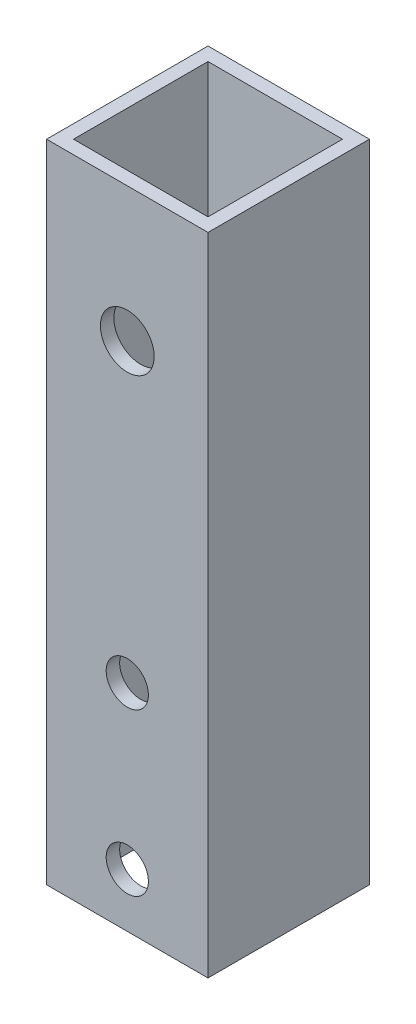
ISO-10303-21;
HEADER;
FILE_DESCRIPTION(('STEP AP214'),'2;1');
FILE_NAME('part.step','',(''),(''),'','','');
FILE_SCHEMA(('AUTOMOTIVE_DESIGN { 1 0 10303 214 1 1 1 1 }'));
ENDSEC;
DATA;
#1=APPLICATION_CONTEXT('core data for automotive mechanical design processes');
#2=APPLICATION_PROTOCOL_DEFINITION('international standard','automotive_design',2000,#1);
#3=PRODUCT_CONTEXT('',#1,'mechanical');
#4=PRODUCT('Part','Part','',(#3));
#5=PRODUCT_RELATED_PRODUCT_CATEGORY('part','',(#4));
#6=PRODUCT_DEFINITION_FORMATION('','',#4);
#7=PRODUCT_DEFINITION_CONTEXT('part definition',#1,'design');
#8=PRODUCT_DEFINITION('design','',#6,#7);
#9=PRODUCT_DEFINITION_SHAPE('','',#8);
#10=(LENGTH_UNIT() NAMED_UNIT(*) SI_UNIT(.MILLI.,.METRE.));
#11=(NAMED_UNIT(*) PLANE_ANGLE_UNIT() SI_UNIT($,.RADIAN.));
#12=(NAMED_UNIT(*) SI_UNIT($,.STERADIAN.) SOLID_ANGLE_UNIT());
#13=UNCERTAINTY_MEASURE_WITH_UNIT(LENGTH_MEASURE(1.E-05),#10,'distance_accuracy_value','');
#14=(GEOMETRIC_REPRESENTATION_CONTEXT(3) GLOBAL_UNCERTAINTY_ASSIGNED_CONTEXT((#13)) GLOBAL_UNIT_ASSIGNED_CONTEXT((#10,
#11,#12)) REPRESENTATION_CONTEXT('',''));
#15=CARTESIAN_POINT('',(0.,0.,0.));
#16=DIRECTION('',(0.,0.,1.));
#17=DIRECTION('',(1.,0.,0.));
#18=AXIS2_PLACEMENT_3D('',#15,#16,#17);
#19=CARTESIAN_POINT('',(0.,76.2,0.));
#20=DIRECTION('',(0.,-1.,0.));
#21=DIRECTION('',(0.,0.,-1.));
#22=AXIS2_PLACEMENT_3D('',#19,#20,#21);
#23=PLANE('',#22);
#24=DIRECTION('',(0.,0.,-1.));
#25=VECTOR('',#24,1.);
#26=CARTESIAN_POINT('',(9.525,76.2,9.525));
#27=LINE('',#26,#25);
#28=CARTESIAN_POINT('',(9.525,76.2,9.525));
#29=VERTEX_POINT('',#28);
#30=CARTESIAN_POINT('',(9.525,76.2,-9.525));
#31=VERTEX_POINT('',#30);
#32=EDGE_CURVE('E141',#29,#31,#27,.T.);
#33=ORIENTED_EDGE('',*,*,#32,.T.);
#34=DIRECTION('',(-1.,0.,0.));
#35=VECTOR('',#34,1.);
#36=CARTESIAN_POINT('',(-9.525,76.2,-9.525));
#37=LINE('',#36,#35);
#38=CARTESIAN_POINT('',(-9.525,76.2,-9.525));
#39=VERTEX_POINT('',#38);
#40=EDGE_CURVE('E144',#31,#39,#37,.T.);
#41=ORIENTED_EDGE('',*,*,#40,.T.);
#42=DIRECTION('',(0.,0.,1.));
#43=VECTOR('',#42,1.);
#44=CARTESIAN_POINT('',(-9.525,76.2,9.525));
#45=LINE('',#44,#43);
#46=CARTESIAN_POINT('',(-9.525,76.2,9.525));
#47=VERTEX_POINT('',#46);
#48=EDGE_CURVE('E147',#39,#47,#45,.T.);
#49=ORIENTED_EDGE('',*,*,#48,.T.);
#50=DIRECTION('',(1.,0.,0.));
#51=VECTOR('',#50,1.);
#52=CARTESIAN_POINT('',(-9.525,76.2,9.525));
#53=LINE('',#52,#51);
#54=EDGE_CURVE('E149',#47,#29,#53,.T.);
#55=ORIENTED_EDGE('',*,*,#54,.T.);
#56=EDGE_LOOP('',(#33,#41,#49,#55));
#57=FACE_BOUND('',#56,.T.);
#58=DIRECTION('',(0.,0.,1.));
#59=VECTOR('',#58,1.);
#60=CARTESIAN_POINT('',(-7.9375,76.2,7.9375));
#61=LINE('',#60,#59);
#62=CARTESIAN_POINT('',(-7.9375,76.2,-7.9375));
#63=VERTEX_POINT('',#62);
#64=CARTESIAN_POINT('',(-7.9375,76.2,7.9375));
#65=VERTEX_POINT('',#64);
#66=EDGE_CURVE('E103',#63,#65,#61,.T.);
#67=ORIENTED_EDGE('',*,*,#66,.F.);
#68=DIRECTION('',(-1.,0.,0.));
#69=VECTOR('',#68,1.);
#70=CARTESIAN_POINT('',(-7.9375,76.2,-7.9375));
#71=LINE('',#70,#69);
#72=CARTESIAN_POINT('',(7.9375,76.2,-7.9375));
#73=VERTEX_POINT('',#72);
#74=EDGE_CURVE('E125',#73,#63,#71,.T.);
#75=ORIENTED_EDGE('',*,*,#74,.F.);
#76=DIRECTION('',(0.,0.,-1.));
#77=VECTOR('',#76,1.);
#78=CARTESIAN_POINT('',(7.9375,76.2,7.9375));
#79=LINE('',#78,#77);
#80=CARTESIAN_POINT('',(7.9375,76.2,7.9375));
#81=VERTEX_POINT('',#80);
#82=EDGE_CURVE('E123',#81,#73,#79,.T.);
#83=ORIENTED_EDGE('',*,*,#82,.F.);
#84=DIRECTION('',(1.,0.,0.));
#85=VECTOR('',#84,1.);
#86=CARTESIAN_POINT('',(-7.9375,76.2,7.9375));
#87=LINE('',#86,#85);
#88=EDGE_CURVE('E111',#65,#81,#87,.T.);
#89=ORIENTED_EDGE('',*,*,#88,.F.);
#90=EDGE_LOOP('',(#67,#75,#83,#89));
#91=FACE_BOUND('',#90,.T.);
#92=ADVANCED_FACE('F36',(#57,#91),#23,.F.);
#93=CARTESIAN_POINT('',(0.,0.,0.));
#94=DIRECTION('',(0.,-1.,0.));
#95=DIRECTION('',(0.,0.,-1.));
#96=AXIS2_PLACEMENT_3D('',#93,#94,#95);
#97=PLANE('',#96);
#98=DIRECTION('',(0.,0.,-1.));
#99=VECTOR('',#98,1.);
#100=CARTESIAN_POINT('',(9.525,0.,9.525));
#101=LINE('',#100,#99);
#102=CARTESIAN_POINT('',(9.525,0.,9.525));
#103=VERTEX_POINT('',#102);
#104=CARTESIAN_POINT('',(9.525,0.,-9.525));
#105=VERTEX_POINT('',#104);
#106=EDGE_CURVE('E119',#103,#105,#101,.T.);
#107=ORIENTED_EDGE('',*,*,#106,.F.);
#108=DIRECTION('',(1.,0.,0.));
#109=VECTOR('',#108,1.);
#110=CARTESIAN_POINT('',(-9.525,0.,9.525));
#111=LINE('',#110,#109);
#112=CARTESIAN_POINT('',(-9.525,0.,9.525));
#113=VERTEX_POINT('',#112);
#114=EDGE_CURVE('E145',#113,#103,#111,.T.);
#115=ORIENTED_EDGE('',*,*,#114,.F.);
#116=DIRECTION('',(0.,0.,1.));
#117=VECTOR('',#116,1.);
#118=CARTESIAN_POINT('',(-9.525,0.,9.525));
#119=LINE('',#118,#117);
#120=CARTESIAN_POINT('',(-9.525,0.,-9.525));
#121=VERTEX_POINT('',#120);
#122=EDGE_CURVE('E156',#121,#113,#119,.T.);
#123=ORIENTED_EDGE('',*,*,#122,.F.);
#124=DIRECTION('',(-1.,0.,0.));
#125=VECTOR('',#124,1.);
#126=CARTESIAN_POINT('',(-9.525,0.,-9.525));
#127=LINE('',#126,#125);
#128=EDGE_CURVE('E154',#105,#121,#127,.T.);
#129=ORIENTED_EDGE('',*,*,#128,.F.);
#130=EDGE_LOOP('',(#107,#115,#123,#129));
#131=FACE_BOUND('',#130,.T.);
#132=DIRECTION('',(-1.,0.,0.));
#133=VECTOR('',#132,1.);
#134=CARTESIAN_POINT('',(-7.9375,0.,-7.9375));
#135=LINE('',#134,#133);
#136=CARTESIAN_POINT('',(7.9375,0.,-7.9375));
#137=VERTEX_POINT('',#136);
#138=CARTESIAN_POINT('',(-7.9375,0.,-7.9375));
#139=VERTEX_POINT('',#138);
#140=EDGE_CURVE('E112',#137,#139,#135,.T.);
#141=ORIENTED_EDGE('',*,*,#140,.T.);
#142=DIRECTION('',(0.,0.,1.));
#143=VECTOR('',#142,1.);
#144=CARTESIAN_POINT('',(-7.9375,0.,7.9375));
#145=LINE('',#144,#143);
#146=CARTESIAN_POINT('',(-7.9375,0.,7.9375));
#147=VERTEX_POINT('',#146);
#148=EDGE_CURVE('E61',#139,#147,#145,.T.);
#149=ORIENTED_EDGE('',*,*,#148,.T.);
#150=DIRECTION('',(1.,0.,0.));
#151=VECTOR('',#150,1.);
#152=CARTESIAN_POINT('',(-7.9375,0.,7.9375));
#153=LINE('',#152,#151);
#154=CARTESIAN_POINT('',(7.9375,0.,7.9375));
#155=VERTEX_POINT('',#154);
#156=EDGE_CURVE('E118',#147,#155,#153,.T.);
#157=ORIENTED_EDGE('',*,*,#156,.T.);
#158=DIRECTION('',(0.,0.,-1.));
#159=VECTOR('',#158,1.);
#160=CARTESIAN_POINT('',(7.9375,0.,7.9375));
#161=LINE('',#160,#159);
#162=EDGE_CURVE('E133',#155,#137,#161,.T.);
#163=ORIENTED_EDGE('',*,*,#162,.T.);
#164=EDGE_LOOP('',(#141,#149,#157,#163));
#165=FACE_BOUND('',#164,.T.);
#166=ADVANCED_FACE('F214',(#131,#165),#97,.T.);
#167=CARTESIAN_POINT('',(9.525,76.2,9.525));
#168=DIRECTION('',(-1.,0.,0.));
#169=DIRECTION('',(0.,0.,1.));
#170=AXIS2_PLACEMENT_3D('',#167,#168,#169);
#171=PLANE('',#170);
#172=ORIENTED_EDGE('',*,*,#106,.T.);
#173=DIRECTION('',(0.,-1.,0.));
#174=VECTOR('',#173,1.);
#175=CARTESIAN_POINT('',(9.525,76.2,-9.525));
#176=LINE('',#175,#174);
#177=EDGE_CURVE('E11',#31,#105,#176,.T.);
#178=ORIENTED_EDGE('',*,*,#177,.F.);
#179=ORIENTED_EDGE('',*,*,#32,.F.);
#180=DIRECTION('',(0.,-1.,0.));
#181=VECTOR('',#180,1.);
#182=CARTESIAN_POINT('',(9.525,76.2,9.525));
#183=LINE('',#182,#181);
#184=EDGE_CURVE('E151',#29,#103,#183,.T.);
#185=ORIENTED_EDGE('',*,*,#184,.T.);
#186=EDGE_LOOP('',(#172,#178,#179,#185));
#187=FACE_BOUND('',#186,.T.);
#188=ADVANCED_FACE('F38',(#187),#171,.F.);
#189=CARTESIAN_POINT('',(-9.525,76.2,-9.525));
#190=DIRECTION('',(0.,0.,1.));
#191=DIRECTION('',(1.,0.,0.));
#192=AXIS2_PLACEMENT_3D('',#189,#190,#191);
#193=PLANE('',#192);
#194=CARTESIAN_POINT('',(0.,60.325,-9.525));
#195=DIRECTION('',(0.,0.,1.));
#196=DIRECTION('',(1.,0.,0.));
#197=AXIS2_PLACEMENT_3D('',#194,#195,#196);
#198=CIRCLE('',#197,3.175);
#199=CARTESIAN_POINT('',(3.175,60.325,-9.525));
#200=VERTEX_POINT('',#199);
#201=EDGE_CURVE('E238',#200,#200,#198,.T.);
#202=ORIENTED_EDGE('',*,*,#201,.T.);
#203=EDGE_LOOP('',(#202));
#204=FACE_BOUND('',#203,.T.);
#205=CARTESIAN_POINT('',(0.,25.4,-9.525));
#206=DIRECTION('',(0.,0.,1.));
#207=DIRECTION('',(1.,0.,0.));
#208=AXIS2_PLACEMENT_3D('',#205,#206,#207);
#209=CIRCLE('',#208,2.4892);
#210=CARTESIAN_POINT('',(2.4892,25.4,-9.525));
#211=VERTEX_POINT('',#210);
#212=EDGE_CURVE('E172',#211,#211,#209,.T.);
#213=ORIENTED_EDGE('',*,*,#212,.T.);
#214=EDGE_LOOP('',(#213));
#215=FACE_BOUND('',#214,.T.);
#216=CARTESIAN_POINT('',(0.,6.35,-9.525));
#217=DIRECTION('',(0.,0.,1.));
#218=DIRECTION('',(1.,0.,0.));
#219=AXIS2_PLACEMENT_3D('',#216,#217,#218);
#220=CIRCLE('',#219,2.4892);
#221=CARTESIAN_POINT('',(2.4892,6.35,-9.525));
#222=VERTEX_POINT('',#221);
#223=EDGE_CURVE('E168',#222,#222,#220,.T.);
#224=ORIENTED_EDGE('',*,*,#223,.T.);
#225=EDGE_LOOP('',(#224));
#226=FACE_BOUND('',#225,.T.);
#227=ORIENTED_EDGE('',*,*,#128,.T.);
#228=DIRECTION('',(0.,-1.,0.));
#229=VECTOR('',#228,1.);
#230=CARTESIAN_POINT('',(-9.525,76.2,-9.525));
#231=LINE('',#230,#229);
#232=EDGE_CURVE('E45',#39,#121,#231,.T.);
#233=ORIENTED_EDGE('',*,*,#232,.F.);
#234=ORIENTED_EDGE('',*,*,#40,.F.);
#235=ORIENTED_EDGE('',*,*,#177,.T.);
#236=EDGE_LOOP('',(#227,#233,#234,#235));
#237=FACE_BOUND('',#236,.T.);
#238=ADVANCED_FACE('F228',(#204,#215,#226,#237),#193,.F.);
#239=CARTESIAN_POINT('',(-9.525,76.2,9.525));
#240=DIRECTION('',(1.,0.,0.));
#241=DIRECTION('',(0.,0.,-1.));
#242=AXIS2_PLACEMENT_3D('',#239,#240,#241);
#243=PLANE('',#242);
#244=ORIENTED_EDGE('',*,*,#122,.T.);
#245=DIRECTION('',(0.,-1.,0.));
#246=VECTOR('',#245,1.);
#247=CARTESIAN_POINT('',(-9.525,76.2,9.525));
#248=LINE('',#247,#246);
#249=EDGE_CURVE('E161',#47,#113,#248,.T.);
#250=ORIENTED_EDGE('',*,*,#249,.F.);
#251=ORIENTED_EDGE('',*,*,#48,.F.);
#252=ORIENTED_EDGE('',*,*,#232,.T.);
#253=EDGE_LOOP('',(#244,#250,#251,#252));
#254=FACE_BOUND('',#253,.T.);
#255=ADVANCED_FACE('F225',(#254),#243,.F.);
#256=CARTESIAN_POINT('',(-9.525,76.2,9.525));
#257=DIRECTION('',(0.,0.,-1.));
#258=DIRECTION('',(-1.,0.,0.));
#259=AXIS2_PLACEMENT_3D('',#256,#257,#258);
#260=PLANE('',#259);
#261=CARTESIAN_POINT('',(0.,60.325,9.525));
#262=DIRECTION('',(0.,0.,1.));
#263=DIRECTION('',(1.,0.,0.));
#264=AXIS2_PLACEMENT_3D('',#261,#262,#263);
#265=CIRCLE('',#264,3.175);
#266=CARTESIAN_POINT('',(3.175,60.325,9.525));
#267=VERTEX_POINT('',#266);
#268=EDGE_CURVE('E283',#267,#267,#265,.T.);
#269=ORIENTED_EDGE('',*,*,#268,.F.);
#270=EDGE_LOOP('',(#269));
#271=FACE_BOUND('',#270,.T.);
#272=CARTESIAN_POINT('',(0.,25.4,9.525));
#273=DIRECTION('',(0.,0.,1.));
#274=DIRECTION('',(1.,0.,0.));
#275=AXIS2_PLACEMENT_3D('',#272,#273,#274);
#276=CIRCLE('',#275,2.4892);
#277=CARTESIAN_POINT('',(2.4892,25.4,9.525));
#278=VERTEX_POINT('',#277);
#279=EDGE_CURVE('E179',#278,#278,#276,.T.);
#280=ORIENTED_EDGE('',*,*,#279,.F.);
#281=EDGE_LOOP('',(#280));
#282=FACE_BOUND('',#281,.T.);
#283=CARTESIAN_POINT('',(0.,6.35,9.525));
#284=DIRECTION('',(0.,0.,1.));
#285=DIRECTION('',(1.,0.,0.));
#286=AXIS2_PLACEMENT_3D('',#283,#284,#285);
#287=CIRCLE('',#286,2.4892);
#288=CARTESIAN_POINT('',(2.4892,6.35,9.525));
#289=VERTEX_POINT('',#288);
#290=EDGE_CURVE('E176',#289,#289,#287,.T.);
#291=ORIENTED_EDGE('',*,*,#290,.F.);
#292=EDGE_LOOP('',(#291));
#293=FACE_BOUND('',#292,.T.);
#294=ORIENTED_EDGE('',*,*,#114,.T.);
#295=ORIENTED_EDGE('',*,*,#184,.F.);
#296=ORIENTED_EDGE('',*,*,#54,.F.);
#297=ORIENTED_EDGE('',*,*,#249,.T.);
#298=EDGE_LOOP('',(#294,#295,#296,#297));
#299=FACE_BOUND('',#298,.T.);
#300=ADVANCED_FACE('F209',(#271,#282,#293,#299),#260,.F.);
#301=CARTESIAN_POINT('',(-7.9375,76.2,7.9375));
#302=DIRECTION('',(1.,0.,0.));
#303=DIRECTION('',(0.,0.,-1.));
#304=AXIS2_PLACEMENT_3D('',#301,#302,#303);
#305=PLANE('',#304);
#306=ORIENTED_EDGE('',*,*,#148,.F.);
#307=DIRECTION('',(0.,-1.,0.));
#308=VECTOR('',#307,1.);
#309=CARTESIAN_POINT('',(-7.9375,76.2,-7.9375));
#310=LINE('',#309,#308);
#311=EDGE_CURVE('E107',#63,#139,#310,.T.);
#312=ORIENTED_EDGE('',*,*,#311,.F.);
#313=ORIENTED_EDGE('',*,*,#66,.T.);
#314=DIRECTION('',(0.,-1.,0.));
#315=VECTOR('',#314,1.);
#316=CARTESIAN_POINT('',(-7.9375,76.2,7.9375));
#317=LINE('',#316,#315);
#318=EDGE_CURVE('E106',#65,#147,#317,.T.);
#319=ORIENTED_EDGE('',*,*,#318,.T.);
#320=EDGE_LOOP('',(#306,#312,#313,#319));
#321=FACE_BOUND('',#320,.T.);
#322=ADVANCED_FACE('F105',(#321),#305,.T.);
#323=CARTESIAN_POINT('',(-7.9375,76.2,7.9375));
#324=DIRECTION('',(0.,0.,-1.));
#325=DIRECTION('',(-1.,0.,0.));
#326=AXIS2_PLACEMENT_3D('',#323,#324,#325);
#327=PLANE('',#326);
#328=CARTESIAN_POINT('',(0.,60.325,7.9375));
#329=DIRECTION('',(0.,0.,-1.));
#330=DIRECTION('',(-1.,0.,0.));
#331=AXIS2_PLACEMENT_3D('',#328,#329,#330);
#332=CIRCLE('',#331,3.175);
#333=CARTESIAN_POINT('',(3.175,60.325,7.9375));
#334=VERTEX_POINT('',#333);
#335=EDGE_CURVE('E184',#334,#334,#332,.T.);
#336=ORIENTED_EDGE('',*,*,#335,.F.);
#337=EDGE_LOOP('',(#336));
#338=FACE_BOUND('',#337,.T.);
#339=CARTESIAN_POINT('',(0.,25.4,7.9375));
#340=DIRECTION('',(0.,0.,-1.));
#341=DIRECTION('',(-1.,0.,0.));
#342=AXIS2_PLACEMENT_3D('',#339,#340,#341);
#343=CIRCLE('',#342,2.4892);
#344=CARTESIAN_POINT('',(2.4892,25.4,7.9375));
#345=VERTEX_POINT('',#344);
#346=EDGE_CURVE('E171',#345,#345,#343,.T.);
#347=ORIENTED_EDGE('',*,*,#346,.F.);
#348=EDGE_LOOP('',(#347));
#349=FACE_BOUND('',#348,.T.);
#350=CARTESIAN_POINT('',(0.,6.35,7.9375));
#351=DIRECTION('',(0.,0.,-1.));
#352=DIRECTION('',(-1.,0.,0.));
#353=AXIS2_PLACEMENT_3D('',#350,#351,#352);
#354=CIRCLE('',#353,2.4892);
#355=CARTESIAN_POINT('',(2.4892,6.35,7.9375));
#356=VERTEX_POINT('',#355);
#357=EDGE_CURVE('E131',#356,#356,#354,.T.);
#358=ORIENTED_EDGE('',*,*,#357,.F.);
#359=EDGE_LOOP('',(#358));
#360=FACE_BOUND('',#359,.T.);
#361=ORIENTED_EDGE('',*,*,#156,.F.);
#362=ORIENTED_EDGE('',*,*,#318,.F.);
#363=ORIENTED_EDGE('',*,*,#88,.T.);
#364=DIRECTION('',(0.,-1.,0.));
#365=VECTOR('',#364,1.);
#366=CARTESIAN_POINT('',(7.9375,76.2,7.9375));
#367=LINE('',#366,#365);
#368=EDGE_CURVE('E120',#81,#155,#367,.T.);
#369=ORIENTED_EDGE('',*,*,#368,.T.);
#370=EDGE_LOOP('',(#361,#362,#363,#369));
#371=FACE_BOUND('',#370,.T.);
#372=ADVANCED_FACE('F115',(#338,#349,#360,#371),#327,.T.);
#373=CARTESIAN_POINT('',(7.9375,76.2,7.9375));
#374=DIRECTION('',(-1.,0.,0.));
#375=DIRECTION('',(0.,0.,1.));
#376=AXIS2_PLACEMENT_3D('',#373,#374,#375);
#377=PLANE('',#376);
#378=ORIENTED_EDGE('',*,*,#162,.F.);
#379=ORIENTED_EDGE('',*,*,#368,.F.);
#380=ORIENTED_EDGE('',*,*,#82,.T.);
#381=DIRECTION('',(0.,-1.,0.));
#382=VECTOR('',#381,1.);
#383=CARTESIAN_POINT('',(7.9375,76.2,-7.9375));
#384=LINE('',#383,#382);
#385=EDGE_CURVE('E53',#73,#137,#384,.T.);
#386=ORIENTED_EDGE('',*,*,#385,.T.);
#387=EDGE_LOOP('',(#378,#379,#380,#386));
#388=FACE_BOUND('',#387,.T.);
#389=ADVANCED_FACE('F199',(#388),#377,.T.);
#390=CARTESIAN_POINT('',(-7.9375,76.2,-7.9375));
#391=DIRECTION('',(0.,0.,1.));
#392=DIRECTION('',(1.,0.,0.));
#393=AXIS2_PLACEMENT_3D('',#390,#391,#392);
#394=PLANE('',#393);
#395=CARTESIAN_POINT('',(0.,60.325,-7.9375));
#396=DIRECTION('',(0.,0.,1.));
#397=DIRECTION('',(1.,0.,0.));
#398=AXIS2_PLACEMENT_3D('',#395,#396,#397);
#399=CIRCLE('',#398,3.175);
#400=CARTESIAN_POINT('',(3.175,60.325,-7.9375));
#401=VERTEX_POINT('',#400);
#402=EDGE_CURVE('E40',#401,#401,#399,.T.);
#403=ORIENTED_EDGE('',*,*,#402,.F.);
#404=EDGE_LOOP('',(#403));
#405=FACE_BOUND('',#404,.T.);
#406=CARTESIAN_POINT('',(0.,25.4,-7.9375));
#407=DIRECTION('',(0.,0.,1.));
#408=DIRECTION('',(1.,0.,0.));
#409=AXIS2_PLACEMENT_3D('',#406,#407,#408);
#410=CIRCLE('',#409,2.4892);
#411=CARTESIAN_POINT('',(2.4892,25.4,-7.9375));
#412=VERTEX_POINT('',#411);
#413=EDGE_CURVE('E169',#412,#412,#410,.T.);
#414=ORIENTED_EDGE('',*,*,#413,.F.);
#415=EDGE_LOOP('',(#414));
#416=FACE_BOUND('',#415,.T.);
#417=CARTESIAN_POINT('',(0.,6.35,-7.9375));
#418=DIRECTION('',(0.,0.,1.));
#419=DIRECTION('',(1.,0.,0.));
#420=AXIS2_PLACEMENT_3D('',#417,#418,#419);
#421=CIRCLE('',#420,2.4892);
#422=CARTESIAN_POINT('',(2.4892,6.35,-7.9375));
#423=VERTEX_POINT('',#422);
#424=EDGE_CURVE('E166',#423,#423,#421,.T.);
#425=ORIENTED_EDGE('',*,*,#424,.F.);
#426=EDGE_LOOP('',(#425));
#427=FACE_BOUND('',#426,.T.);
#428=ORIENTED_EDGE('',*,*,#140,.F.);
#429=ORIENTED_EDGE('',*,*,#385,.F.);
#430=ORIENTED_EDGE('',*,*,#74,.T.);
#431=ORIENTED_EDGE('',*,*,#311,.T.);
#432=EDGE_LOOP('',(#428,#429,#430,#431));
#433=FACE_BOUND('',#432,.T.);
#434=ADVANCED_FACE('F206',(#405,#416,#427,#433),#394,.T.);
#435=CARTESIAN_POINT('',(0.,6.35,-9.525));
#436=DIRECTION('',(0.,0.,1.));
#437=DIRECTION('',(1.,0.,0.));
#438=AXIS2_PLACEMENT_3D('',#435,#436,#437);
#439=CYLINDRICAL_SURFACE('',#438,2.4892);
#440=CARTESIAN_POINT('',(2.4892,6.35,-7.9375));
#441=CARTESIAN_POINT('',(2.4892,6.35,-7.95403645833333));
#442=CARTESIAN_POINT('',(2.4892,6.35,-7.97057291666667));
#443=CARTESIAN_POINT('',(2.4892,6.35,-8.00364583333334));
#444=CARTESIAN_POINT('',(2.4892,6.35,-8.02018229166667));
#445=CARTESIAN_POINT('',(2.4892,6.35,-8.05325520833333));
#446=CARTESIAN_POINT('',(2.4892,6.35,-8.06979166666667));
#447=CARTESIAN_POINT('',(2.4892,6.35,-8.10286458333333));
#448=CARTESIAN_POINT('',(2.4892,6.35,-8.11940104166667));
#449=CARTESIAN_POINT('',(2.4892,6.35,-8.15247395833333));
#450=CARTESIAN_POINT('',(2.4892,6.35,-8.16901041666667));
#451=CARTESIAN_POINT('',(2.4892,6.35,-8.20208333333333));
#452=CARTESIAN_POINT('',(2.4892,6.35,-8.21861979166667));
#453=CARTESIAN_POINT('',(2.4892,6.35,-8.25169270833333));
#454=CARTESIAN_POINT('',(2.4892,6.35,-8.26822916666667));
#455=CARTESIAN_POINT('',(2.4892,6.35,-8.30130208333333));
#456=CARTESIAN_POINT('',(2.4892,6.35,-8.31783854166667));
#457=CARTESIAN_POINT('',(2.4892,6.35,-8.35091145833333));
#458=CARTESIAN_POINT('',(2.4892,6.35,-8.36744791666667));
#459=CARTESIAN_POINT('',(2.4892,6.35,-8.40052083333333));
#460=CARTESIAN_POINT('',(2.4892,6.35,-8.41705729166667));
#461=CARTESIAN_POINT('',(2.4892,6.35,-8.45013020833333));
#462=CARTESIAN_POINT('',(2.4892,6.35,-8.46666666666667));
#463=CARTESIAN_POINT('',(2.4892,6.35,-8.49973958333333));
#464=CARTESIAN_POINT('',(2.4892,6.35,-8.51627604166667));
#465=CARTESIAN_POINT('',(2.4892,6.35,-8.54934895833333));
#466=CARTESIAN_POINT('',(2.4892,6.35,-8.56588541666667));
#467=CARTESIAN_POINT('',(2.4892,6.35,-8.59895833333333));
#468=CARTESIAN_POINT('',(2.4892,6.35,-8.61549479166667));
#469=CARTESIAN_POINT('',(2.4892,6.35,-8.64856770833333));
#470=CARTESIAN_POINT('',(2.4892,6.35,-8.66510416666667));
#471=CARTESIAN_POINT('',(2.4892,6.35,-8.69817708333333));
#472=CARTESIAN_POINT('',(2.4892,6.35,-8.71471354166667));
#473=CARTESIAN_POINT('',(2.4892,6.35,-8.74778645833333));
#474=CARTESIAN_POINT('',(2.4892,6.35,-8.76432291666667));
#475=CARTESIAN_POINT('',(2.4892,6.35,-8.79739583333333));
#476=CARTESIAN_POINT('',(2.4892,6.35,-8.81393229166667));
#477=CARTESIAN_POINT('',(2.4892,6.35,-8.84700520833333));
#478=CARTESIAN_POINT('',(2.4892,6.35,-8.86354166666667));
#479=CARTESIAN_POINT('',(2.4892,6.35,-8.89661458333333));
#480=CARTESIAN_POINT('',(2.4892,6.35,-8.91315104166667));
#481=CARTESIAN_POINT('',(2.4892,6.35,-8.94622395833333));
#482=CARTESIAN_POINT('',(2.4892,6.35,-8.96276041666667));
#483=CARTESIAN_POINT('',(2.4892,6.35,-8.99583333333333));
#484=CARTESIAN_POINT('',(2.4892,6.35,-9.01236979166667));
#485=CARTESIAN_POINT('',(2.4892,6.35,-9.04544270833333));
#486=CARTESIAN_POINT('',(2.4892,6.35,-9.06197916666667));
#487=CARTESIAN_POINT('',(2.4892,6.35,-9.09505208333333));
#488=CARTESIAN_POINT('',(2.4892,6.35,-9.11158854166667));
#489=CARTESIAN_POINT('',(2.4892,6.35,-9.14466145833333));
#490=CARTESIAN_POINT('',(2.4892,6.35,-9.16119791666667));
#491=CARTESIAN_POINT('',(2.4892,6.35,-9.19427083333333));
#492=CARTESIAN_POINT('',(2.4892,6.35,-9.21080729166667));
#493=CARTESIAN_POINT('',(2.4892,6.35,-9.24388020833333));
#494=CARTESIAN_POINT('',(2.4892,6.35,-9.26041666666667));
#495=CARTESIAN_POINT('',(2.4892,6.35,-9.29348958333333));
#496=CARTESIAN_POINT('',(2.4892,6.35,-9.31002604166667));
#497=CARTESIAN_POINT('',(2.4892,6.35,-9.34309895833333));
#498=CARTESIAN_POINT('',(2.4892,6.35,-9.35963541666667));
#499=CARTESIAN_POINT('',(2.4892,6.35,-9.39270833333333));
#500=CARTESIAN_POINT('',(2.4892,6.35,-9.40924479166667));
#501=CARTESIAN_POINT('',(2.4892,6.35,-9.44231770833333));
#502=CARTESIAN_POINT('',(2.4892,6.35,-9.45885416666667));
#503=CARTESIAN_POINT('',(2.4892,6.35,-9.49192708333333));
#504=CARTESIAN_POINT('',(2.4892,6.35,-9.50846354166667));
#505=CARTESIAN_POINT('',(2.4892,6.35,-9.525));
#506=B_SPLINE_CURVE_WITH_KNOTS('',3,(#440,#441,#442,#443,#444,#445,#446,#447,#448,#449,#450,
#451,#452,#453,#454,#455,#456,#457,#458,#459,#460,#461,#462,#463,#464,#465,#466,#467,#468,#469,
#470,#471,#472,#473,#474,#475,#476,#477,#478,#479,#480,#481,#482,#483,#484,#485,#486,#487,#488,
#489,#490,#491,#492,#493,#494,#495,#496,#497,#498,#499,#500,#501,#502,#503,#504,#505),
.UNSPECIFIED.,.F.,.F.,(4,2,2,2,2,2,2,2,2,2,2,2,2,2,2,2,2,2,2,2,2,2,2,2,2,2,2,2,2,2,2,2,4),(0.,
0.0496093749999989,0.0992187499999995,0.148828124999998,0.198437499999999,0.248046875,
0.297656249999998,0.347265624999999,0.396875,0.446484374999999,0.496093749999999,0.545703125,
0.595312499999999,0.644921874999999,0.694531249999998,0.744140624999999,0.793749999999999,
0.843359374999998,0.892968749999999,0.942578124999998,0.992187499999998,1.041796875,1.09140625,
1.141015625,1.190625,1.240234375,1.28984375,1.339453125,1.3890625,1.438671875,1.48828125,
1.537890625,1.5875),.UNSPECIFIED.);
#507=EDGE_CURVE('BSEAM256',#423,#222,#506,.T.);
#508=ORIENTED_EDGE('',*,*,#424,.T.);
#509=ORIENTED_EDGE('',*,*,#223,.F.);
#510=ORIENTED_EDGE('',*,*,#507,.T.);
#511=ORIENTED_EDGE('',*,*,#507,.F.);
#512=EDGE_LOOP('',(#508,#510,#509,#511));
#513=FACE_BOUND('',#512,.T.);
#514=ADVANCED_FACE('F256',(#513),#439,.F.);
#515=CARTESIAN_POINT('',(2.4892,6.35,7.9375));
#516=CARTESIAN_POINT('',(2.4892,6.35,7.95403645833333));
#517=CARTESIAN_POINT('',(2.4892,6.35,7.97057291666666));
#518=CARTESIAN_POINT('',(2.4892,6.35,8.00364583333333));
#519=CARTESIAN_POINT('',(2.4892,6.35,8.02018229166666));
#520=CARTESIAN_POINT('',(2.4892,6.35,8.05325520833333));
#521=CARTESIAN_POINT('',(2.4892,6.35,8.06979166666666));
#522=CARTESIAN_POINT('',(2.4892,6.35,8.10286458333333));
#523=CARTESIAN_POINT('',(2.4892,6.35,8.11940104166666));
#524=CARTESIAN_POINT('',(2.4892,6.35,8.15247395833333));
#525=CARTESIAN_POINT('',(2.4892,6.35,8.16901041666667));
#526=CARTESIAN_POINT('',(2.4892,6.35,8.20208333333333));
#527=CARTESIAN_POINT('',(2.4892,6.35,8.21861979166667));
#528=CARTESIAN_POINT('',(2.4892,6.35,8.25169270833333));
#529=CARTESIAN_POINT('',(2.4892,6.35,8.26822916666666));
#530=CARTESIAN_POINT('',(2.4892,6.35,8.30130208333333));
#531=CARTESIAN_POINT('',(2.4892,6.35,8.31783854166667));
#532=CARTESIAN_POINT('',(2.4892,6.35,8.35091145833333));
#533=CARTESIAN_POINT('',(2.4892,6.35,8.36744791666666));
#534=CARTESIAN_POINT('',(2.4892,6.35,8.40052083333333));
#535=CARTESIAN_POINT('',(2.4892,6.35,8.41705729166667));
#536=CARTESIAN_POINT('',(2.4892,6.35,8.45013020833333));
#537=CARTESIAN_POINT('',(2.4892,6.35,8.46666666666667));
#538=CARTESIAN_POINT('',(2.4892,6.35,8.49973958333333));
#539=CARTESIAN_POINT('',(2.4892,6.35,8.51627604166666));
#540=CARTESIAN_POINT('',(2.4892,6.35,8.54934895833333));
#541=CARTESIAN_POINT('',(2.4892,6.35,8.56588541666667));
#542=CARTESIAN_POINT('',(2.4892,6.35,8.59895833333333));
#543=CARTESIAN_POINT('',(2.4892,6.35,8.61549479166667));
#544=CARTESIAN_POINT('',(2.4892,6.35,8.64856770833333));
#545=CARTESIAN_POINT('',(2.4892,6.35,8.66510416666667));
#546=CARTESIAN_POINT('',(2.4892,6.35,8.69817708333333));
#547=CARTESIAN_POINT('',(2.4892,6.35,8.71471354166667));
#548=CARTESIAN_POINT('',(2.4892,6.35,8.74778645833333));
#549=CARTESIAN_POINT('',(2.4892,6.35,8.76432291666667));
#550=CARTESIAN_POINT('',(2.4892,6.35,8.79739583333333));
#551=CARTESIAN_POINT('',(2.4892,6.35,8.81393229166667));
#552=CARTESIAN_POINT('',(2.4892,6.35,8.84700520833333));
#553=CARTESIAN_POINT('',(2.4892,6.35,8.86354166666667));
#554=CARTESIAN_POINT('',(2.4892,6.35,8.89661458333333));
#555=CARTESIAN_POINT('',(2.4892,6.35,8.91315104166667));
#556=CARTESIAN_POINT('',(2.4892,6.35,8.94622395833333));
#557=CARTESIAN_POINT('',(2.4892,6.35,8.96276041666667));
#558=CARTESIAN_POINT('',(2.4892,6.35,8.99583333333333));
#559=CARTESIAN_POINT('',(2.4892,6.35,9.01236979166667));
#560=CARTESIAN_POINT('',(2.4892,6.35,9.04544270833333));
#561=CARTESIAN_POINT('',(2.4892,6.35,9.06197916666667));
#562=CARTESIAN_POINT('',(2.4892,6.35,9.09505208333333));
#563=CARTESIAN_POINT('',(2.4892,6.35,9.11158854166667));
#564=CARTESIAN_POINT('',(2.4892,6.35,9.14466145833333));
#565=CARTESIAN_POINT('',(2.4892,6.35,9.16119791666667));
#566=CARTESIAN_POINT('',(2.4892,6.35,9.19427083333333));
#567=CARTESIAN_POINT('',(2.4892,6.35,9.21080729166667));
#568=CARTESIAN_POINT('',(2.4892,6.35,9.24388020833333));
#569=CARTESIAN_POINT('',(2.4892,6.35,9.26041666666667));
#570=CARTESIAN_POINT('',(2.4892,6.35,9.29348958333333));
#571=CARTESIAN_POINT('',(2.4892,6.35,9.31002604166667));
#572=CARTESIAN_POINT('',(2.4892,6.35,9.34309895833333));
#573=CARTESIAN_POINT('',(2.4892,6.35,9.35963541666667));
#574=CARTESIAN_POINT('',(2.4892,6.35,9.39270833333333));
#575=CARTESIAN_POINT('',(2.4892,6.35,9.40924479166667));
#576=CARTESIAN_POINT('',(2.4892,6.35,9.44231770833333));
#577=CARTESIAN_POINT('',(2.4892,6.35,9.45885416666667));
#578=CARTESIAN_POINT('',(2.4892,6.35,9.49192708333334));
#579=CARTESIAN_POINT('',(2.4892,6.35,9.50846354166667));
#580=CARTESIAN_POINT('',(2.4892,6.35,9.525));
#581=B_SPLINE_CURVE_WITH_KNOTS('',3,(#515,#516,#517,#518,#519,#520,#521,#522,#523,#524,#525,
#526,#527,#528,#529,#530,#531,#532,#533,#534,#535,#536,#537,#538,#539,#540,#541,#542,#543,#544,
#545,#546,#547,#548,#549,#550,#551,#552,#553,#554,#555,#556,#557,#558,#559,#560,#561,#562,#563,
#564,#565,#566,#567,#568,#569,#570,#571,#572,#573,#574,#575,#576,#577,#578,#579,#580),
.UNSPECIFIED.,.F.,.F.,(4,2,2,2,2,2,2,2,2,2,2,2,2,2,2,2,2,2,2,2,2,2,2,2,2,2,2,2,2,2,2,2,4),(0.,
0.0496093749999989,0.0992187500000012,0.148828125,0.198437500000002,0.248046875000001,
0.29765625,0.347265625000003,0.396875000000001,0.446484375,0.496093750000003,0.545703125000002,
0.5953125,0.644921875000003,0.694531250000002,0.744140625000004,0.793750000000003,
0.843359375000002,0.892968750000004,0.942578125000003,0.992187500000005,1.041796875,1.09140625,
1.14101562500001,1.190625,1.240234375,1.28984375000001,1.339453125,1.3890625,1.43867187500001,
1.48828125,1.53789062500001,1.58750000000001),.UNSPECIFIED.);
#582=EDGE_CURVE('BSEAM195',#356,#289,#581,.T.);
#583=ORIENTED_EDGE('',*,*,#357,.T.);
#584=ORIENTED_EDGE('',*,*,#290,.T.);
#585=ORIENTED_EDGE('',*,*,#582,.T.);
#586=ORIENTED_EDGE('',*,*,#582,.F.);
#587=EDGE_LOOP('',(#583,#585,#584,#586));
#588=FACE_BOUND('',#587,.T.);
#589=ADVANCED_FACE('F195',(#588),#439,.F.);
#590=CARTESIAN_POINT('',(0.,25.4,-9.525));
#591=DIRECTION('',(0.,0.,1.));
#592=DIRECTION('',(1.,0.,0.));
#593=AXIS2_PLACEMENT_3D('',#590,#591,#592);
#594=CYLINDRICAL_SURFACE('',#593,2.4892);
#595=CARTESIAN_POINT('',(2.4892,25.4,-7.9375));
#596=CARTESIAN_POINT('',(2.4892,25.4,-7.95403645833333));
#597=CARTESIAN_POINT('',(2.4892,25.4,-7.97057291666667));
#598=CARTESIAN_POINT('',(2.4892,25.4,-8.00364583333334));
#599=CARTESIAN_POINT('',(2.4892,25.4,-8.02018229166667));
#600=CARTESIAN_POINT('',(2.4892,25.4,-8.05325520833333));
#601=CARTESIAN_POINT('',(2.4892,25.4,-8.06979166666667));
#602=CARTESIAN_POINT('',(2.4892,25.4,-8.10286458333333));
#603=CARTESIAN_POINT('',(2.4892,25.4,-8.11940104166667));
#604=CARTESIAN_POINT('',(2.4892,25.4,-8.15247395833333));
#605=CARTESIAN_POINT('',(2.4892,25.4,-8.16901041666667));
#606=CARTESIAN_POINT('',(2.4892,25.4,-8.20208333333333));
#607=CARTESIAN_POINT('',(2.4892,25.4,-8.21861979166667));
#608=CARTESIAN_POINT('',(2.4892,25.4,-8.25169270833333));
#609=CARTESIAN_POINT('',(2.4892,25.4,-8.26822916666667));
#610=CARTESIAN_POINT('',(2.4892,25.4,-8.30130208333333));
#611=CARTESIAN_POINT('',(2.4892,25.4,-8.31783854166667));
#612=CARTESIAN_POINT('',(2.4892,25.4,-8.35091145833333));
#613=CARTESIAN_POINT('',(2.4892,25.4,-8.36744791666667));
#614=CARTESIAN_POINT('',(2.4892,25.4,-8.40052083333333));
#615=CARTESIAN_POINT('',(2.4892,25.4,-8.41705729166667));
#616=CARTESIAN_POINT('',(2.4892,25.4,-8.45013020833333));
#617=CARTESIAN_POINT('',(2.4892,25.4,-8.46666666666667));
#618=CARTESIAN_POINT('',(2.4892,25.4,-8.49973958333333));
#619=CARTESIAN_POINT('',(2.4892,25.4,-8.51627604166667));
#620=CARTESIAN_POINT('',(2.4892,25.4,-8.54934895833333));
#621=CARTESIAN_POINT('',(2.4892,25.4,-8.56588541666667));
#622=CARTESIAN_POINT('',(2.4892,25.4,-8.59895833333333));
#623=CARTESIAN_POINT('',(2.4892,25.4,-8.61549479166667));
#624=CARTESIAN_POINT('',(2.4892,25.4,-8.64856770833333));
#625=CARTESIAN_POINT('',(2.4892,25.4,-8.66510416666667));
#626=CARTESIAN_POINT('',(2.4892,25.4,-8.69817708333333));
#627=CARTESIAN_POINT('',(2.4892,25.4,-8.71471354166667));
#628=CARTESIAN_POINT('',(2.4892,25.4,-8.74778645833333));
#629=CARTESIAN_POINT('',(2.4892,25.4,-8.76432291666667));
#630=CARTESIAN_POINT('',(2.4892,25.4,-8.79739583333333));
#631=CARTESIAN_POINT('',(2.4892,25.4,-8.81393229166667));
#632=CARTESIAN_POINT('',(2.4892,25.4,-8.84700520833333));
#633=CARTESIAN_POINT('',(2.4892,25.4,-8.86354166666667));
#634=CARTESIAN_POINT('',(2.4892,25.4,-8.89661458333333));
#635=CARTESIAN_POINT('',(2.4892,25.4,-8.91315104166667));
#636=CARTESIAN_POINT('',(2.4892,25.4,-8.94622395833333));
#637=CARTESIAN_POINT('',(2.4892,25.4,-8.96276041666667));
#638=CARTESIAN_POINT('',(2.4892,25.4,-8.99583333333333));
#639=CARTESIAN_POINT('',(2.4892,25.4,-9.01236979166667));
#640=CARTESIAN_POINT('',(2.4892,25.4,-9.04544270833333));
#641=CARTESIAN_POINT('',(2.4892,25.4,-9.06197916666667));
#642=CARTESIAN_POINT('',(2.4892,25.4,-9.09505208333333));
#643=CARTESIAN_POINT('',(2.4892,25.4,-9.11158854166667));
#644=CARTESIAN_POINT('',(2.4892,25.4,-9.14466145833333));
#645=CARTESIAN_POINT('',(2.4892,25.4,-9.16119791666667));
#646=CARTESIAN_POINT('',(2.4892,25.4,-9.19427083333333));
#647=CARTESIAN_POINT('',(2.4892,25.4,-9.21080729166667));
#648=CARTESIAN_POINT('',(2.4892,25.4,-9.24388020833333));
#649=CARTESIAN_POINT('',(2.4892,25.4,-9.26041666666667));
#650=CARTESIAN_POINT('',(2.4892,25.4,-9.29348958333333));
#651=CARTESIAN_POINT('',(2.4892,25.4,-9.31002604166667));
#652=CARTESIAN_POINT('',(2.4892,25.4,-9.34309895833333));
#653=CARTESIAN_POINT('',(2.4892,25.4,-9.35963541666667));
#654=CARTESIAN_POINT('',(2.4892,25.4,-9.39270833333333));
#655=CARTESIAN_POINT('',(2.4892,25.4,-9.40924479166667));
#656=CARTESIAN_POINT('',(2.4892,25.4,-9.44231770833333));
#657=CARTESIAN_POINT('',(2.4892,25.4,-9.45885416666667));
#658=CARTESIAN_POINT('',(2.4892,25.4,-9.49192708333333));
#659=CARTESIAN_POINT('',(2.4892,25.4,-9.50846354166667));
#660=CARTESIAN_POINT('',(2.4892,25.4,-9.525));
#661=B_SPLINE_CURVE_WITH_KNOTS('',3,(#595,#596,#597,#598,#599,#600,#601,#602,#603,#604,#605,
#606,#607,#608,#609,#610,#611,#612,#613,#614,#615,#616,#617,#618,#619,#620,#621,#622,#623,#624,
#625,#626,#627,#628,#629,#630,#631,#632,#633,#634,#635,#636,#637,#638,#639,#640,#641,#642,#643,
#644,#645,#646,#647,#648,#649,#650,#651,#652,#653,#654,#655,#656,#657,#658,#659,#660),
.UNSPECIFIED.,.F.,.F.,(4,2,2,2,2,2,2,2,2,2,2,2,2,2,2,2,2,2,2,2,2,2,2,2,2,2,2,2,2,2,2,2,4),(0.,
0.0496093749999989,0.0992187499999995,0.148828124999998,0.198437499999999,0.248046875,
0.297656249999998,0.347265624999999,0.396875,0.446484374999999,0.496093749999999,0.545703125,
0.595312499999999,0.644921874999999,0.694531249999998,0.744140624999999,0.793749999999999,
0.843359374999998,0.892968749999999,0.942578124999998,0.992187499999998,1.041796875,1.09140625,
1.141015625,1.190625,1.240234375,1.28984375,1.339453125,1.3890625,1.438671875,1.48828125,
1.537890625,1.5875),.UNSPECIFIED.);
#662=EDGE_CURVE('BSEAM267',#412,#211,#661,.T.);
#663=ORIENTED_EDGE('',*,*,#413,.T.);
#664=ORIENTED_EDGE('',*,*,#212,.F.);
#665=ORIENTED_EDGE('',*,*,#662,.T.);
#666=ORIENTED_EDGE('',*,*,#662,.F.);
#667=EDGE_LOOP('',(#663,#665,#664,#666));
#668=FACE_BOUND('',#667,.T.);
#669=ADVANCED_FACE('F267',(#668),#594,.F.);
#670=CARTESIAN_POINT('',(2.4892,25.4,7.9375));
#671=CARTESIAN_POINT('',(2.4892,25.4,7.95403645833333));
#672=CARTESIAN_POINT('',(2.4892,25.4,7.97057291666666));
#673=CARTESIAN_POINT('',(2.4892,25.4,8.00364583333333));
#674=CARTESIAN_POINT('',(2.4892,25.4,8.02018229166666));
#675=CARTESIAN_POINT('',(2.4892,25.4,8.05325520833333));
#676=CARTESIAN_POINT('',(2.4892,25.4,8.06979166666666));
#677=CARTESIAN_POINT('',(2.4892,25.4,8.10286458333333));
#678=CARTESIAN_POINT('',(2.4892,25.4,8.11940104166666));
#679=CARTESIAN_POINT('',(2.4892,25.4,8.15247395833333));
#680=CARTESIAN_POINT('',(2.4892,25.4,8.16901041666667));
#681=CARTESIAN_POINT('',(2.4892,25.4,8.20208333333333));
#682=CARTESIAN_POINT('',(2.4892,25.4,8.21861979166667));
#683=CARTESIAN_POINT('',(2.4892,25.4,8.25169270833333));
#684=CARTESIAN_POINT('',(2.4892,25.4,8.26822916666666));
#685=CARTESIAN_POINT('',(2.4892,25.4,8.30130208333333));
#686=CARTESIAN_POINT('',(2.4892,25.4,8.31783854166667));
#687=CARTESIAN_POINT('',(2.4892,25.4,8.35091145833333));
#688=CARTESIAN_POINT('',(2.4892,25.4,8.36744791666666));
#689=CARTESIAN_POINT('',(2.4892,25.4,8.40052083333333));
#690=CARTESIAN_POINT('',(2.4892,25.4,8.41705729166667));
#691=CARTESIAN_POINT('',(2.4892,25.4,8.45013020833333));
#692=CARTESIAN_POINT('',(2.4892,25.4,8.46666666666667));
#693=CARTESIAN_POINT('',(2.4892,25.4,8.49973958333333));
#694=CARTESIAN_POINT('',(2.4892,25.4,8.51627604166666));
#695=CARTESIAN_POINT('',(2.4892,25.4,8.54934895833333));
#696=CARTESIAN_POINT('',(2.4892,25.4,8.56588541666667));
#697=CARTESIAN_POINT('',(2.4892,25.4,8.59895833333333));
#698=CARTESIAN_POINT('',(2.4892,25.4,8.61549479166667));
#699=CARTESIAN_POINT('',(2.4892,25.4,8.64856770833333));
#700=CARTESIAN_POINT('',(2.4892,25.4,8.66510416666667));
#701=CARTESIAN_POINT('',(2.4892,25.4,8.69817708333333));
#702=CARTESIAN_POINT('',(2.4892,25.4,8.71471354166667));
#703=CARTESIAN_POINT('',(2.4892,25.4,8.74778645833333));
#704=CARTESIAN_POINT('',(2.4892,25.4,8.76432291666667));
#705=CARTESIAN_POINT('',(2.4892,25.4,8.79739583333333));
#706=CARTESIAN_POINT('',(2.4892,25.4,8.81393229166667));
#707=CARTESIAN_POINT('',(2.4892,25.4,8.84700520833333));
#708=CARTESIAN_POINT('',(2.4892,25.4,8.86354166666667));
#709=CARTESIAN_POINT('',(2.4892,25.4,8.89661458333333));
#710=CARTESIAN_POINT('',(2.4892,25.4,8.91315104166667));
#711=CARTESIAN_POINT('',(2.4892,25.4,8.94622395833333));
#712=CARTESIAN_POINT('',(2.4892,25.4,8.96276041666667));
#713=CARTESIAN_POINT('',(2.4892,25.4,8.99583333333333));
#714=CARTESIAN_POINT('',(2.4892,25.4,9.01236979166667));
#715=CARTESIAN_POINT('',(2.4892,25.4,9.04544270833333));
#716=CARTESIAN_POINT('',(2.4892,25.4,9.06197916666667));
#717=CARTESIAN_POINT('',(2.4892,25.4,9.09505208333333));
#718=CARTESIAN_POINT('',(2.4892,25.4,9.11158854166667));
#719=CARTESIAN_POINT('',(2.4892,25.4,9.14466145833333));
#720=CARTESIAN_POINT('',(2.4892,25.4,9.16119791666667));
#721=CARTESIAN_POINT('',(2.4892,25.4,9.19427083333333));
#722=CARTESIAN_POINT('',(2.4892,25.4,9.21080729166667));
#723=CARTESIAN_POINT('',(2.4892,25.4,9.24388020833333));
#724=CARTESIAN_POINT('',(2.4892,25.4,9.26041666666667));
#725=CARTESIAN_POINT('',(2.4892,25.4,9.29348958333333));
#726=CARTESIAN_POINT('',(2.4892,25.4,9.31002604166667));
#727=CARTESIAN_POINT('',(2.4892,25.4,9.34309895833333));
#728=CARTESIAN_POINT('',(2.4892,25.4,9.35963541666667));
#729=CARTESIAN_POINT('',(2.4892,25.4,9.39270833333333));
#730=CARTESIAN_POINT('',(2.4892,25.4,9.40924479166667));
#731=CARTESIAN_POINT('',(2.4892,25.4,9.44231770833333));
#732=CARTESIAN_POINT('',(2.4892,25.4,9.45885416666667));
#733=CARTESIAN_POINT('',(2.4892,25.4,9.49192708333334));
#734=CARTESIAN_POINT('',(2.4892,25.4,9.50846354166667));
#735=CARTESIAN_POINT('',(2.4892,25.4,9.525));
#736=B_SPLINE_CURVE_WITH_KNOTS('',3,(#670,#671,#672,#673,#674,#675,#676,#677,#678,#679,#680,
#681,#682,#683,#684,#685,#686,#687,#688,#689,#690,#691,#692,#693,#694,#695,#696,#697,#698,#699,
#700,#701,#702,#703,#704,#705,#706,#707,#708,#709,#710,#711,#712,#713,#714,#715,#716,#717,#718,
#719,#720,#721,#722,#723,#724,#725,#726,#727,#728,#729,#730,#731,#732,#733,#734,#735),
.UNSPECIFIED.,.F.,.F.,(4,2,2,2,2,2,2,2,2,2,2,2,2,2,2,2,2,2,2,2,2,2,2,2,2,2,2,2,2,2,2,2,4),(0.,
0.0496093749999989,0.0992187500000012,0.148828125,0.198437500000002,0.248046875000001,
0.29765625,0.347265625000003,0.396875000000001,0.446484375,0.496093750000003,0.545703125000002,
0.5953125,0.644921875000003,0.694531250000002,0.744140625000004,0.793750000000003,
0.843359375000002,0.892968750000004,0.942578125000003,0.992187500000005,1.041796875,1.09140625,
1.14101562500001,1.190625,1.240234375,1.28984375000001,1.339453125,1.3890625,1.43867187500001,
1.48828125,1.53789062500001,1.58750000000001),.UNSPECIFIED.);
#737=EDGE_CURVE('BSEAM270',#345,#278,#736,.T.);
#738=ORIENTED_EDGE('',*,*,#346,.T.);
#739=ORIENTED_EDGE('',*,*,#279,.T.);
#740=ORIENTED_EDGE('',*,*,#737,.T.);
#741=ORIENTED_EDGE('',*,*,#737,.F.);
#742=EDGE_LOOP('',(#738,#740,#739,#741));
#743=FACE_BOUND('',#742,.T.);
#744=ADVANCED_FACE('F270',(#743),#594,.F.);
#745=CARTESIAN_POINT('',(0.,60.325,-9.525));
#746=DIRECTION('',(0.,0.,1.));
#747=DIRECTION('',(1.,0.,0.));
#748=AXIS2_PLACEMENT_3D('',#745,#746,#747);
#749=CYLINDRICAL_SURFACE('',#748,3.175);
#750=CARTESIAN_POINT('',(3.175,60.325,-7.9375));
#751=CARTESIAN_POINT('',(3.175,60.325,-7.95403645833333));
#752=CARTESIAN_POINT('',(3.175,60.325,-7.97057291666667));
#753=CARTESIAN_POINT('',(3.175,60.325,-8.00364583333334));
#754=CARTESIAN_POINT('',(3.175,60.325,-8.02018229166667));
#755=CARTESIAN_POINT('',(3.175,60.325,-8.05325520833333));
#756=CARTESIAN_POINT('',(3.175,60.325,-8.06979166666667));
#757=CARTESIAN_POINT('',(3.175,60.325,-8.10286458333333));
#758=CARTESIAN_POINT('',(3.175,60.325,-8.11940104166667));
#759=CARTESIAN_POINT('',(3.175,60.325,-8.15247395833333));
#760=CARTESIAN_POINT('',(3.175,60.325,-8.16901041666667));
#761=CARTESIAN_POINT('',(3.175,60.325,-8.20208333333333));
#762=CARTESIAN_POINT('',(3.175,60.325,-8.21861979166667));
#763=CARTESIAN_POINT('',(3.175,60.325,-8.25169270833333));
#764=CARTESIAN_POINT('',(3.175,60.325,-8.26822916666667));
#765=CARTESIAN_POINT('',(3.175,60.325,-8.30130208333333));
#766=CARTESIAN_POINT('',(3.175,60.325,-8.31783854166667));
#767=CARTESIAN_POINT('',(3.175,60.325,-8.35091145833333));
#768=CARTESIAN_POINT('',(3.175,60.325,-8.36744791666667));
#769=CARTESIAN_POINT('',(3.175,60.325,-8.40052083333333));
#770=CARTESIAN_POINT('',(3.175,60.325,-8.41705729166667));
#771=CARTESIAN_POINT('',(3.175,60.325,-8.45013020833333));
#772=CARTESIAN_POINT('',(3.175,60.325,-8.46666666666667));
#773=CARTESIAN_POINT('',(3.175,60.325,-8.49973958333333));
#774=CARTESIAN_POINT('',(3.175,60.325,-8.51627604166667));
#775=CARTESIAN_POINT('',(3.175,60.325,-8.54934895833333));
#776=CARTESIAN_POINT('',(3.175,60.325,-8.56588541666667));
#777=CARTESIAN_POINT('',(3.175,60.325,-8.59895833333333));
#778=CARTESIAN_POINT('',(3.175,60.325,-8.61549479166667));
#779=CARTESIAN_POINT('',(3.175,60.325,-8.64856770833333));
#780=CARTESIAN_POINT('',(3.175,60.325,-8.66510416666667));
#781=CARTESIAN_POINT('',(3.175,60.325,-8.69817708333333));
#782=CARTESIAN_POINT('',(3.175,60.325,-8.71471354166667));
#783=CARTESIAN_POINT('',(3.175,60.325,-8.74778645833333));
#784=CARTESIAN_POINT('',(3.175,60.325,-8.76432291666667));
#785=CARTESIAN_POINT('',(3.175,60.325,-8.79739583333333));
#786=CARTESIAN_POINT('',(3.175,60.325,-8.81393229166667));
#787=CARTESIAN_POINT('',(3.175,60.325,-8.84700520833333));
#788=CARTESIAN_POINT('',(3.175,60.325,-8.86354166666667));
#789=CARTESIAN_POINT('',(3.175,60.325,-8.89661458333333));
#790=CARTESIAN_POINT('',(3.175,60.325,-8.91315104166667));
#791=CARTESIAN_POINT('',(3.175,60.325,-8.94622395833333));
#792=CARTESIAN_POINT('',(3.175,60.325,-8.96276041666667));
#793=CARTESIAN_POINT('',(3.175,60.325,-8.99583333333333));
#794=CARTESIAN_POINT('',(3.175,60.325,-9.01236979166667));
#795=CARTESIAN_POINT('',(3.175,60.325,-9.04544270833333));
#796=CARTESIAN_POINT('',(3.175,60.325,-9.06197916666667));
#797=CARTESIAN_POINT('',(3.175,60.325,-9.09505208333333));
#798=CARTESIAN_POINT('',(3.175,60.325,-9.11158854166667));
#799=CARTESIAN_POINT('',(3.175,60.325,-9.14466145833333));
#800=CARTESIAN_POINT('',(3.175,60.325,-9.16119791666667));
#801=CARTESIAN_POINT('',(3.175,60.325,-9.19427083333333));
#802=CARTESIAN_POINT('',(3.175,60.325,-9.21080729166667));
#803=CARTESIAN_POINT('',(3.175,60.325,-9.24388020833333));
#804=CARTESIAN_POINT('',(3.175,60.325,-9.26041666666667));
#805=CARTESIAN_POINT('',(3.175,60.325,-9.29348958333333));
#806=CARTESIAN_POINT('',(3.175,60.325,-9.31002604166667));
#807=CARTESIAN_POINT('',(3.175,60.325,-9.34309895833333));
#808=CARTESIAN_POINT('',(3.175,60.325,-9.35963541666667));
#809=CARTESIAN_POINT('',(3.175,60.325,-9.39270833333333));
#810=CARTESIAN_POINT('',(3.175,60.325,-9.40924479166667));
#811=CARTESIAN_POINT('',(3.175,60.325,-9.44231770833333));
#812=CARTESIAN_POINT('',(3.175,60.325,-9.45885416666667));
#813=CARTESIAN_POINT('',(3.175,60.325,-9.49192708333333));
#814=CARTESIAN_POINT('',(3.175,60.325,-9.50846354166667));
#815=CARTESIAN_POINT('',(3.175,60.325,-9.525));
#816=B_SPLINE_CURVE_WITH_KNOTS('',3,(#750,#751,#752,#753,#754,#755,#756,#757,#758,#759,#760,
#761,#762,#763,#764,#765,#766,#767,#768,#769,#770,#771,#772,#773,#774,#775,#776,#777,#778,#779,
#780,#781,#782,#783,#784,#785,#786,#787,#788,#789,#790,#791,#792,#793,#794,#795,#796,#797,#798,
#799,#800,#801,#802,#803,#804,#805,#806,#807,#808,#809,#810,#811,#812,#813,#814,#815),
.UNSPECIFIED.,.F.,.F.,(4,2,2,2,2,2,2,2,2,2,2,2,2,2,2,2,2,2,2,2,2,2,2,2,2,2,2,2,2,2,2,2,4),(0.,
0.0496093749999989,0.0992187499999995,0.148828124999998,0.198437499999999,0.248046875,
0.297656249999998,0.347265624999999,0.396875,0.446484374999999,0.496093749999999,0.545703125,
0.595312499999999,0.644921874999999,0.694531249999998,0.744140624999999,0.793749999999999,
0.843359374999998,0.892968749999999,0.942578124999998,0.992187499999998,1.041796875,1.09140625,
1.141015625,1.190625,1.240234375,1.28984375,1.339453125,1.3890625,1.438671875,1.48828125,
1.537890625,1.5875),.UNSPECIFIED.);
#817=EDGE_CURVE('BSEAM271',#401,#200,#816,.T.);
#818=ORIENTED_EDGE('',*,*,#402,.T.);
#819=ORIENTED_EDGE('',*,*,#201,.F.);
#820=ORIENTED_EDGE('',*,*,#817,.T.);
#821=ORIENTED_EDGE('',*,*,#817,.F.);
#822=EDGE_LOOP('',(#818,#820,#819,#821));
#823=FACE_BOUND('',#822,.T.);
#824=ADVANCED_FACE('F271',(#823),#749,.F.);
#825=CARTESIAN_POINT('',(3.175,60.325,7.9375));
#826=CARTESIAN_POINT('',(3.175,60.325,7.95403645833333));
#827=CARTESIAN_POINT('',(3.175,60.325,7.97057291666666));
#828=CARTESIAN_POINT('',(3.175,60.325,8.00364583333333));
#829=CARTESIAN_POINT('',(3.175,60.325,8.02018229166666));
#830=CARTESIAN_POINT('',(3.175,60.325,8.05325520833333));
#831=CARTESIAN_POINT('',(3.175,60.325,8.06979166666666));
#832=CARTESIAN_POINT('',(3.175,60.325,8.10286458333333));
#833=CARTESIAN_POINT('',(3.175,60.325,8.11940104166666));
#834=CARTESIAN_POINT('',(3.175,60.325,8.15247395833333));
#835=CARTESIAN_POINT('',(3.175,60.325,8.16901041666667));
#836=CARTESIAN_POINT('',(3.175,60.325,8.20208333333333));
#837=CARTESIAN_POINT('',(3.175,60.325,8.21861979166667));
#838=CARTESIAN_POINT('',(3.175,60.325,8.25169270833333));
#839=CARTESIAN_POINT('',(3.175,60.325,8.26822916666666));
#840=CARTESIAN_POINT('',(3.175,60.325,8.30130208333333));
#841=CARTESIAN_POINT('',(3.175,60.325,8.31783854166667));
#842=CARTESIAN_POINT('',(3.175,60.325,8.35091145833333));
#843=CARTESIAN_POINT('',(3.175,60.325,8.36744791666666));
#844=CARTESIAN_POINT('',(3.175,60.325,8.40052083333333));
#845=CARTESIAN_POINT('',(3.175,60.325,8.41705729166667));
#846=CARTESIAN_POINT('',(3.175,60.325,8.45013020833333));
#847=CARTESIAN_POINT('',(3.175,60.325,8.46666666666667));
#848=CARTESIAN_POINT('',(3.175,60.325,8.49973958333333));
#849=CARTESIAN_POINT('',(3.175,60.325,8.51627604166666));
#850=CARTESIAN_POINT('',(3.175,60.325,8.54934895833333));
#851=CARTESIAN_POINT('',(3.175,60.325,8.56588541666667));
#852=CARTESIAN_POINT('',(3.175,60.325,8.59895833333333));
#853=CARTESIAN_POINT('',(3.175,60.325,8.61549479166667));
#854=CARTESIAN_POINT('',(3.175,60.325,8.64856770833333));
#855=CARTESIAN_POINT('',(3.175,60.325,8.66510416666667));
#856=CARTESIAN_POINT('',(3.175,60.325,8.69817708333333));
#857=CARTESIAN_POINT('',(3.175,60.325,8.71471354166667));
#858=CARTESIAN_POINT('',(3.175,60.325,8.74778645833333));
#859=CARTESIAN_POINT('',(3.175,60.325,8.76432291666667));
#860=CARTESIAN_POINT('',(3.175,60.325,8.79739583333333));
#861=CARTESIAN_POINT('',(3.175,60.325,8.81393229166667));
#862=CARTESIAN_POINT('',(3.175,60.325,8.84700520833333));
#863=CARTESIAN_POINT('',(3.175,60.325,8.86354166666667));
#864=CARTESIAN_POINT('',(3.175,60.325,8.89661458333333));
#865=CARTESIAN_POINT('',(3.175,60.325,8.91315104166667));
#866=CARTESIAN_POINT('',(3.175,60.325,8.94622395833333));
#867=CARTESIAN_POINT('',(3.175,60.325,8.96276041666667));
#868=CARTESIAN_POINT('',(3.175,60.325,8.99583333333333));
#869=CARTESIAN_POINT('',(3.175,60.325,9.01236979166667));
#870=CARTESIAN_POINT('',(3.175,60.325,9.04544270833333));
#871=CARTESIAN_POINT('',(3.175,60.325,9.06197916666667));
#872=CARTESIAN_POINT('',(3.175,60.325,9.09505208333333));
#873=CARTESIAN_POINT('',(3.175,60.325,9.11158854166667));
#874=CARTESIAN_POINT('',(3.175,60.325,9.14466145833333));
#875=CARTESIAN_POINT('',(3.175,60.325,9.16119791666667));
#876=CARTESIAN_POINT('',(3.175,60.325,9.19427083333333));
#877=CARTESIAN_POINT('',(3.175,60.325,9.21080729166667));
#878=CARTESIAN_POINT('',(3.175,60.325,9.24388020833333));
#879=CARTESIAN_POINT('',(3.175,60.325,9.26041666666667));
#880=CARTESIAN_POINT('',(3.175,60.325,9.29348958333333));
#881=CARTESIAN_POINT('',(3.175,60.325,9.31002604166667));
#882=CARTESIAN_POINT('',(3.175,60.325,9.34309895833333));
#883=CARTESIAN_POINT('',(3.175,60.325,9.35963541666667));
#884=CARTESIAN_POINT('',(3.175,60.325,9.39270833333333));
#885=CARTESIAN_POINT('',(3.175,60.325,9.40924479166667));
#886=CARTESIAN_POINT('',(3.175,60.325,9.44231770833333));
#887=CARTESIAN_POINT('',(3.175,60.325,9.45885416666667));
#888=CARTESIAN_POINT('',(3.175,60.325,9.49192708333334));
#889=CARTESIAN_POINT('',(3.175,60.325,9.50846354166667));
#890=CARTESIAN_POINT('',(3.175,60.325,9.525));
#891=B_SPLINE_CURVE_WITH_KNOTS('',3,(#825,#826,#827,#828,#829,#830,#831,#832,#833,#834,#835,
#836,#837,#838,#839,#840,#841,#842,#843,#844,#845,#846,#847,#848,#849,#850,#851,#852,#853,#854,
#855,#856,#857,#858,#859,#860,#861,#862,#863,#864,#865,#866,#867,#868,#869,#870,#871,#872,#873,
#874,#875,#876,#877,#878,#879,#880,#881,#882,#883,#884,#885,#886,#887,#888,#889,#890),
.UNSPECIFIED.,.F.,.F.,(4,2,2,2,2,2,2,2,2,2,2,2,2,2,2,2,2,2,2,2,2,2,2,2,2,2,2,2,2,2,2,2,4),(0.,
0.0496093749999989,0.0992187500000012,0.148828125,0.198437500000002,0.248046875000001,
0.29765625,0.347265625000003,0.396875000000001,0.446484375,0.496093750000003,0.545703125000002,
0.5953125,0.644921875000003,0.694531250000002,0.744140625000004,0.793750000000003,
0.843359375000002,0.892968750000004,0.942578125000003,0.992187500000005,1.041796875,1.09140625,
1.14101562500001,1.190625,1.240234375,1.28984375000001,1.339453125,1.3890625,1.43867187500001,
1.48828125,1.53789062500001,1.58750000000001),.UNSPECIFIED.);
#892=EDGE_CURVE('BSEAM273',#334,#267,#891,.T.);
#893=ORIENTED_EDGE('',*,*,#335,.T.);
#894=ORIENTED_EDGE('',*,*,#268,.T.);
#895=ORIENTED_EDGE('',*,*,#892,.T.);
#896=ORIENTED_EDGE('',*,*,#892,.F.);
#897=EDGE_LOOP('',(#893,#895,#894,#896));
#898=FACE_BOUND('',#897,.T.);
#899=ADVANCED_FACE('F273',(#898),#749,.F.);
#900=CLOSED_SHELL('',(#92,#166,#188,#238,#255,#300,#322,#372,#389,#434,#514,#589,#669,#744,#824,#899));
#901=MANIFOLD_SOLID_BREP('B2',#900);
#902=ADVANCED_BREP_SHAPE_REPRESENTATION('',(#18,#901),#14);
#903=SHAPE_DEFINITION_REPRESENTATION(#9,#902);
ENDSEC;
END-ISO-10303-21;
